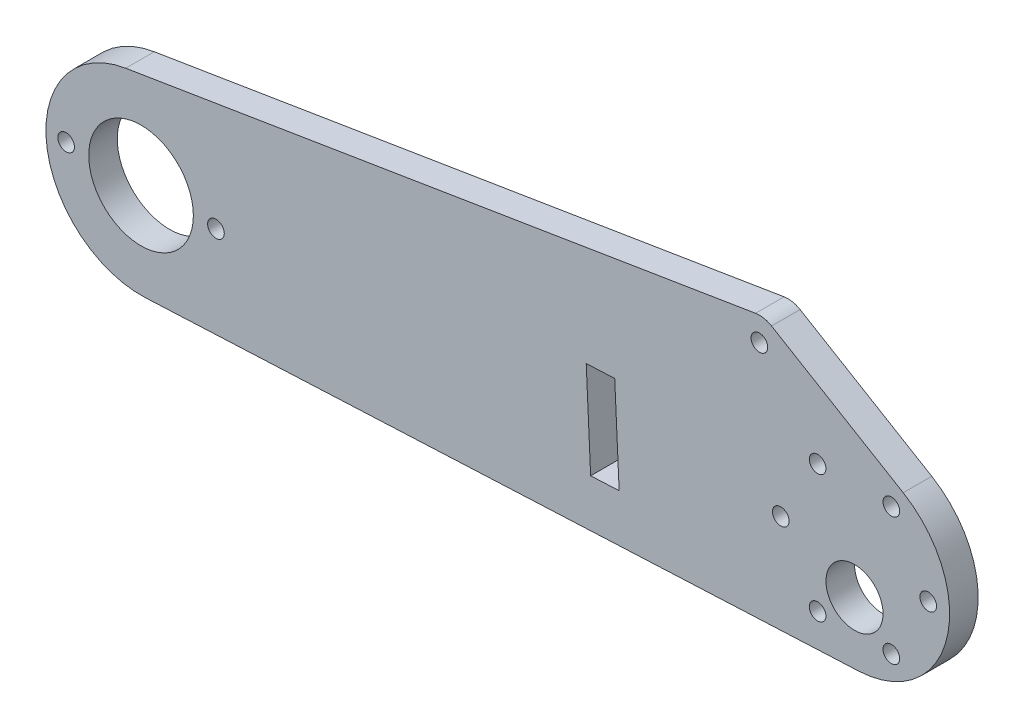
ISO-10303-21;
HEADER;
FILE_DESCRIPTION(('STEP AP214'),'2;1');
FILE_NAME('part.step','',(''),(''),'','','');
FILE_SCHEMA(('AUTOMOTIVE_DESIGN { 1 0 10303 214 1 1 1 1 }'));
ENDSEC;
DATA;
#1=APPLICATION_CONTEXT('core data for automotive mechanical design processes');
#2=APPLICATION_PROTOCOL_DEFINITION('international standard','automotive_design',2000,#1);
#3=PRODUCT_CONTEXT('',#1,'mechanical');
#4=PRODUCT('Part','Part','',(#3));
#5=PRODUCT_RELATED_PRODUCT_CATEGORY('part','',(#4));
#6=PRODUCT_DEFINITION_FORMATION('','',#4);
#7=PRODUCT_DEFINITION_CONTEXT('part definition',#1,'design');
#8=PRODUCT_DEFINITION('design','',#6,#7);
#9=PRODUCT_DEFINITION_SHAPE('','',#8);
#10=(LENGTH_UNIT() NAMED_UNIT(*) SI_UNIT(.MILLI.,.METRE.));
#11=(NAMED_UNIT(*) PLANE_ANGLE_UNIT() SI_UNIT($,.RADIAN.));
#12=(NAMED_UNIT(*) SI_UNIT($,.STERADIAN.) SOLID_ANGLE_UNIT());
#13=UNCERTAINTY_MEASURE_WITH_UNIT(LENGTH_MEASURE(1.E-05),#10,'distance_accuracy_value','');
#14=(GEOMETRIC_REPRESENTATION_CONTEXT(3) GLOBAL_UNCERTAINTY_ASSIGNED_CONTEXT((#13)) GLOBAL_UNIT_ASSIGNED_CONTEXT((#10,
#11,#12)) REPRESENTATION_CONTEXT('',''));
#15=CARTESIAN_POINT('',(0.,0.,0.));
#16=DIRECTION('',(0.,0.,1.));
#17=DIRECTION('',(1.,0.,0.));
#18=AXIS2_PLACEMENT_3D('',#15,#16,#17);
#19=CARTESIAN_POINT('',(0.,0.,4.));
#20=DIRECTION('',(0.,0.,1.));
#21=DIRECTION('',(1.,0.,0.));
#22=AXIS2_PLACEMENT_3D('',#19,#20,#21);
#23=PLANE('',#22);
#24=CARTESIAN_POINT('',(130.00156973698,36.3949428619018,4.));
#25=DIRECTION('',(0.,0.,-1.));
#26=DIRECTION('',(-1.,0.,0.));
#27=AXIS2_PLACEMENT_3D('',#24,#25,#26);
#28=CIRCLE('',#27,1.75);
#29=CARTESIAN_POINT('',(131.75156973698,36.3949428619018,4.));
#30=VERTEX_POINT('',#29);
#31=EDGE_CURVE('E287',#30,#30,#28,.T.);
#32=ORIENTED_EDGE('',*,*,#31,.T.);
#33=EDGE_LOOP('',(#32));
#34=FACE_BOUND('',#33,.T.);
#35=CARTESIAN_POINT('',(150.,0.,4.));
#36=DIRECTION('',(0.,0.,-1.));
#37=DIRECTION('',(-1.,0.,0.));
#38=AXIS2_PLACEMENT_3D('',#35,#36,#37);
#39=CIRCLE('',#38,6.);
#40=CARTESIAN_POINT('',(156.,0.,4.));
#41=VERTEX_POINT('',#40);
#42=EDGE_CURVE('E273',#41,#41,#39,.T.);
#43=ORIENTED_EDGE('',*,*,#42,.T.);
#44=EDGE_LOOP('',(#43));
#45=FACE_BOUND('',#44,.T.);
#46=CARTESIAN_POINT('',(157.75,-6.4233937586588,4.));
#47=DIRECTION('',(0.,0.,-1.));
#48=DIRECTION('',(-1.,0.,0.));
#49=AXIS2_PLACEMENT_3D('',#46,#47,#48);
#50=CIRCLE('',#49,1.75);
#51=CARTESIAN_POINT('',(159.5,-6.4233937586588,4.));
#52=VERTEX_POINT('',#51);
#53=EDGE_CURVE('E241',#52,#52,#50,.T.);
#54=ORIENTED_EDGE('',*,*,#53,.T.);
#55=EDGE_LOOP('',(#54));
#56=FACE_BOUND('',#55,.T.);
#57=CARTESIAN_POINT('',(134.5,7.,4.));
#58=DIRECTION('',(0.,0.,-1.));
#59=DIRECTION('',(-1.,0.,0.));
#60=AXIS2_PLACEMENT_3D('',#57,#58,#59);
#61=CIRCLE('',#60,1.75);
#62=CARTESIAN_POINT('',(136.25,7.,4.));
#63=VERTEX_POINT('',#62);
#64=EDGE_CURVE('E329',#63,#63,#61,.T.);
#65=ORIENTED_EDGE('',*,*,#64,.T.);
#66=EDGE_LOOP('',(#65));
#67=FACE_BOUND('',#66,.T.);
#68=CARTESIAN_POINT('',(142.25,-6.4233937586588,4.));
#69=DIRECTION('',(0.,0.,-1.));
#70=DIRECTION('',(-1.,0.,0.));
#71=AXIS2_PLACEMENT_3D('',#68,#69,#70);
#72=CIRCLE('',#71,1.75);
#73=CARTESIAN_POINT('',(144.,-6.4233937586588,4.));
#74=VERTEX_POINT('',#73);
#75=EDGE_CURVE('E288',#74,#74,#72,.T.);
#76=ORIENTED_EDGE('',*,*,#75,.T.);
#77=EDGE_LOOP('',(#76));
#78=FACE_BOUND('',#77,.T.);
#79=CARTESIAN_POINT('',(142.25,20.4233937586588,4.));
#80=DIRECTION('',(0.,0.,-1.));
#81=DIRECTION('',(-1.,0.,0.));
#82=AXIS2_PLACEMENT_3D('',#79,#80,#81);
#83=CIRCLE('',#82,1.75);
#84=CARTESIAN_POINT('',(144.,20.4233937586588,4.));
#85=VERTEX_POINT('',#84);
#86=EDGE_CURVE('E224',#85,#85,#83,.T.);
#87=ORIENTED_EDGE('',*,*,#86,.T.);
#88=EDGE_LOOP('',(#87));
#89=FACE_BOUND('',#88,.T.);
#90=CARTESIAN_POINT('',(157.75,20.4233937586588,4.));
#91=DIRECTION('',(0.,0.,-1.));
#92=DIRECTION('',(-1.,0.,0.));
#93=AXIS2_PLACEMENT_3D('',#90,#91,#92);
#94=CIRCLE('',#93,1.75);
#95=CARTESIAN_POINT('',(159.5,20.4233937586588,4.));
#96=VERTEX_POINT('',#95);
#97=EDGE_CURVE('E320',#96,#96,#94,.T.);
#98=ORIENTED_EDGE('',*,*,#97,.T.);
#99=EDGE_LOOP('',(#98));
#100=FACE_BOUND('',#99,.T.);
#101=CARTESIAN_POINT('',(165.5,7.,4.));
#102=DIRECTION('',(0.,0.,-1.));
#103=DIRECTION('',(-1.,0.,0.));
#104=AXIS2_PLACEMENT_3D('',#101,#102,#103);
#105=CIRCLE('',#104,1.75);
#106=CARTESIAN_POINT('',(167.25,7.,4.));
#107=VERTEX_POINT('',#106);
#108=EDGE_CURVE('E299',#107,#107,#105,.T.);
#109=ORIENTED_EDGE('',*,*,#108,.T.);
#110=EDGE_LOOP('',(#109));
#111=FACE_BOUND('',#110,.T.);
#112=CARTESIAN_POINT('',(0.,0.,4.));
#113=DIRECTION('',(0.,0.,-1.));
#114=DIRECTION('',(-1.,0.,0.));
#115=AXIS2_PLACEMENT_3D('',#112,#113,#114);
#116=CIRCLE('',#115,11.);
#117=CARTESIAN_POINT('',(11.,0.,4.));
#118=VERTEX_POINT('',#117);
#119=EDGE_CURVE('E293',#118,#118,#116,.T.);
#120=ORIENTED_EDGE('',*,*,#119,.T.);
#121=EDGE_LOOP('',(#120));
#122=FACE_BOUND('',#121,.T.);
#123=DIRECTION('',(0.998912886408086,0.046615934699044,0.));
#124=VECTOR('',#123,1.);
#125=CARTESIAN_POINT('',(49.5610184928074,12.3237304966048,4.));
#126=LINE('',#125,#124);
#127=CARTESIAN_POINT('',(93.5947190141567,14.3786365209344,4.));
#128=VERTEX_POINT('',#127);
#129=CARTESIAN_POINT('',(99.5881963326052,14.6583321291287,4.));
#130=VERTEX_POINT('',#129);
#131=EDGE_CURVE('E310',#128,#130,#126,.T.);
#132=ORIENTED_EDGE('',*,*,#131,.T.);
#133=DIRECTION('',(0.0466159346990444,-0.998912886408086,0.));
#134=VECTOR('',#133,1.);
#135=CARTESIAN_POINT('',(100.287435353091,-0.325361166992615,4.));
#136=LINE('',#135,#134);
#137=CARTESIAN_POINT('',(100.520515026586,-5.31992559903307,4.));
#138=VERTEX_POINT('',#137);
#139=EDGE_CURVE('E214',#130,#138,#136,.T.);
#140=ORIENTED_EDGE('',*,*,#139,.T.);
#141=DIRECTION('',(-0.998912886408086,-0.0466159346990447,0.));
#142=VECTOR('',#141,1.);
#143=CARTESIAN_POINT('',(47.496598527564,-7.79437503565414,4.));
#144=LINE('',#143,#142);
#145=CARTESIAN_POINT('',(94.5270377081376,-5.59962120722733,4.));
#146=VERTEX_POINT('',#145);
#147=EDGE_CURVE('E267',#138,#146,#144,.T.);
#148=ORIENTED_EDGE('',*,*,#147,.T.);
#149=DIRECTION('',(-0.0466159346990444,0.998912886408086,0.));
#150=VECTOR('',#149,1.);
#151=CARTESIAN_POINT('',(93.8277986876519,9.38407208889399,4.));
#152=LINE('',#151,#150);
#153=EDGE_CURVE('E235',#146,#128,#152,.T.);
#154=ORIENTED_EDGE('',*,*,#153,.T.);
#155=EDGE_LOOP('',(#132,#140,#148,#154));
#156=FACE_BOUND('',#155,.T.);
#157=CARTESIAN_POINT('',(15.75,0.,4.));
#158=DIRECTION('',(0.,0.,-1.));
#159=DIRECTION('',(-1.,0.,0.));
#160=AXIS2_PLACEMENT_3D('',#157,#158,#159);
#161=CIRCLE('',#160,1.75);
#162=CARTESIAN_POINT('',(17.5,0.,4.));
#163=VERTEX_POINT('',#162);
#164=EDGE_CURVE('E264',#163,#163,#161,.T.);
#165=ORIENTED_EDGE('',*,*,#164,.T.);
#166=EDGE_LOOP('',(#165));
#167=FACE_BOUND('',#166,.T.);
#168=CARTESIAN_POINT('',(-15.75,0.,4.));
#169=DIRECTION('',(0.,0.,-1.));
#170=DIRECTION('',(-1.,0.,0.));
#171=AXIS2_PLACEMENT_3D('',#168,#169,#170);
#172=CIRCLE('',#171,1.75);
#173=CARTESIAN_POINT('',(-14.,0.,4.));
#174=VERTEX_POINT('',#173);
#175=EDGE_CURVE('E253',#174,#174,#172,.T.);
#176=ORIENTED_EDGE('',*,*,#175,.T.);
#177=EDGE_LOOP('',(#176));
#178=FACE_BOUND('',#177,.T.);
#179=CARTESIAN_POINT('',(0.,0.,4.));
#180=DIRECTION('',(0.,0.,1.));
#181=DIRECTION('',(1.,0.,0.));
#182=AXIS2_PLACEMENT_3D('',#179,#180,#181);
#183=CIRCLE('',#182,20.);
#184=CARTESIAN_POINT('',(-3.21851350401239,19.7393305566448,4.));
#185=VERTEX_POINT('',#184);
#186=CARTESIAN_POINT('',(0.93231869398088,-19.9782577281617,4.));
#187=VERTEX_POINT('',#186);
#188=EDGE_CURVE('E10',#185,#187,#183,.T.);
#189=ORIENTED_EDGE('',*,*,#188,.T.);
#190=DIRECTION('',(0.998912886408086,0.046615934699044,0.));
#191=VECTOR('',#190,1.);
#192=CARTESIAN_POINT('',(0.932318693980881,-19.9782577281617,4.));
#193=LINE('',#192,#191);
#194=CARTESIAN_POINT('',(150.932318693981,-12.9782577281617,4.));
#195=VERTEX_POINT('',#194);
#196=EDGE_CURVE('E183',#187,#195,#193,.T.);
#197=ORIENTED_EDGE('',*,*,#196,.T.);
#198=CARTESIAN_POINT('',(150.,7.,4.));
#199=DIRECTION('',(0.,0.,1.));
#200=DIRECTION('',(1.,0.,0.));
#201=AXIS2_PLACEMENT_3D('',#198,#199,#200);
#202=CIRCLE('',#201,20.);
#203=CARTESIAN_POINT('',(160.245666414947,24.1763302167146,4.));
#204=VERTEX_POINT('',#203);
#205=EDGE_CURVE('E281',#195,#204,#202,.T.);
#206=ORIENTED_EDGE('',*,*,#205,.T.);
#207=DIRECTION('',(-0.858816510835732,0.512283320747356,0.));
#208=VECTOR('',#207,1.);
#209=CARTESIAN_POINT('',(160.245666414947,24.1763302167146,4.));
#210=LINE('',#209,#208);
#211=CARTESIAN_POINT('',(132.562986340717,40.6890254160805,4.));
#212=VERTEX_POINT('',#211);
#213=EDGE_CURVE('E340',#204,#212,#210,.T.);
#214=ORIENTED_EDGE('',*,*,#213,.T.);
#215=CARTESIAN_POINT('',(130.00156973698,36.3949428619018,4.));
#216=DIRECTION('',(0.,0.,1.));
#217=DIRECTION('',(1.,0.,0.));
#218=AXIS2_PLACEMENT_3D('',#215,#216,#217);
#219=CIRCLE('',#218,5.);
#220=CARTESIAN_POINT('',(129.196941360977,41.329775501063,4.));
#221=VERTEX_POINT('',#220);
#222=EDGE_CURVE('E386',#212,#221,#219,.T.);
#223=ORIENTED_EDGE('',*,*,#222,.T.);
#224=DIRECTION('',(-0.986966527832238,-0.16092567520062,0.));
#225=VECTOR('',#224,1.);
#226=CARTESIAN_POINT('',(129.196941360977,41.329775501063,4.));
#227=LINE('',#226,#225);
#228=EDGE_CURVE('E365',#221,#185,#227,.T.);
#229=ORIENTED_EDGE('',*,*,#228,.T.);
#230=EDGE_LOOP('',(#189,#197,#206,#214,#223,#229));
#231=FACE_BOUND('',#230,.T.);
#232=ADVANCED_FACE('F16',(#34,#45,#56,#67,#78,#89,#100,#111,#122,#156,#167,#178,#231),#23,.T.);
#233=CARTESIAN_POINT('',(0.,0.,0.));
#234=DIRECTION('',(0.,0.,1.));
#235=DIRECTION('',(-0.994583300266628,-0.103942574678241,0.));
#236=AXIS2_PLACEMENT_3D('',#233,#234,#235);
#237=CYLINDRICAL_SURFACE('',#236,20.);
#238=DIRECTION('',(0.,0.,1.));
#239=VECTOR('',#238,1.);
#240=CARTESIAN_POINT('',(0.932318693980881,-19.9782577281617,0.));
#241=LINE('',#240,#239);
#242=CARTESIAN_POINT('',(0.93231869398088,-19.9782577281617,-2.));
#243=VERTEX_POINT('',#242);
#244=EDGE_CURVE('E26',#243,#187,#241,.T.);
#245=ORIENTED_EDGE('',*,*,#244,.T.);
#246=ORIENTED_EDGE('',*,*,#188,.F.);
#247=DIRECTION('',(0.,0.,-1.));
#248=VECTOR('',#247,1.);
#249=CARTESIAN_POINT('',(-3.21851350401239,19.7393305566448,0.));
#250=LINE('',#249,#248);
#251=CARTESIAN_POINT('',(-3.21851350401239,19.7393305566448,-2.));
#252=VERTEX_POINT('',#251);
#253=EDGE_CURVE('E201',#185,#252,#250,.T.);
#254=ORIENTED_EDGE('',*,*,#253,.T.);
#255=CARTESIAN_POINT('',(0.,0.,-2.));
#256=DIRECTION('',(0.,0.,-1.));
#257=DIRECTION('',(1.,0.,0.));
#258=AXIS2_PLACEMENT_3D('',#255,#256,#257);
#259=CIRCLE('',#258,20.);
#260=EDGE_CURVE('E192',#243,#252,#259,.T.);
#261=ORIENTED_EDGE('',*,*,#260,.F.);
#262=EDGE_LOOP('',(#245,#246,#254,#261));
#263=FACE_BOUND('',#262,.T.);
#264=ADVANCED_FACE('F199',(#263),#237,.T.);
#265=CARTESIAN_POINT('',(0.932318693980881,-19.9782577281617,0.));
#266=DIRECTION('',(0.046615934699044,-0.998912886408087,0.));
#267=DIRECTION('',(0.,0.,-1.));
#268=AXIS2_PLACEMENT_3D('',#265,#266,#267);
#269=PLANE('',#268);
#270=DIRECTION('',(0.,0.,1.));
#271=VECTOR('',#270,1.);
#272=CARTESIAN_POINT('',(150.932318693981,-12.9782577281617,0.));
#273=LINE('',#272,#271);
#274=CARTESIAN_POINT('',(150.932318693981,-12.9782577281617,-2.));
#275=VERTEX_POINT('',#274);
#276=EDGE_CURVE('E278',#275,#195,#273,.T.);
#277=ORIENTED_EDGE('',*,*,#276,.T.);
#278=ORIENTED_EDGE('',*,*,#196,.F.);
#279=ORIENTED_EDGE('',*,*,#244,.F.);
#280=DIRECTION('',(-0.998912886408086,-0.046615934699044,0.));
#281=VECTOR('',#280,1.);
#282=CARTESIAN_POINT('',(0.932318693980881,-19.9782577281617,-2.));
#283=LINE('',#282,#281);
#284=EDGE_CURVE('E181',#275,#243,#283,.T.);
#285=ORIENTED_EDGE('',*,*,#284,.F.);
#286=EDGE_LOOP('',(#277,#278,#279,#285));
#287=FACE_BOUND('',#286,.T.);
#288=ADVANCED_FACE('F180',(#287),#269,.T.);
#289=CARTESIAN_POINT('',(150.,7.,0.));
#290=DIRECTION('',(0.,0.,1.));
#291=DIRECTION('',(1.,0.,0.));
#292=AXIS2_PLACEMENT_3D('',#289,#290,#291);
#293=CYLINDRICAL_SURFACE('',#292,20.);
#294=DIRECTION('',(0.,0.,1.));
#295=VECTOR('',#294,1.);
#296=CARTESIAN_POINT('',(160.245666414947,24.1763302167146,0.));
#297=LINE('',#296,#295);
#298=CARTESIAN_POINT('',(160.245666414947,24.1763302167146,-2.));
#299=VERTEX_POINT('',#298);
#300=EDGE_CURVE('E336',#299,#204,#297,.T.);
#301=ORIENTED_EDGE('',*,*,#300,.T.);
#302=ORIENTED_EDGE('',*,*,#205,.F.);
#303=ORIENTED_EDGE('',*,*,#276,.F.);
#304=CARTESIAN_POINT('',(150.,7.,-2.));
#305=DIRECTION('',(0.,0.,-1.));
#306=DIRECTION('',(1.,0.,0.));
#307=AXIS2_PLACEMENT_3D('',#304,#305,#306);
#308=CIRCLE('',#307,20.);
#309=EDGE_CURVE('E195',#299,#275,#308,.T.);
#310=ORIENTED_EDGE('',*,*,#309,.F.);
#311=EDGE_LOOP('',(#301,#302,#303,#310));
#312=FACE_BOUND('',#311,.T.);
#313=ADVANCED_FACE('F511',(#312),#293,.T.);
#314=CARTESIAN_POINT('',(160.245666414947,24.1763302167146,0.));
#315=DIRECTION('',(0.512283320747356,0.858816510835732,0.));
#316=DIRECTION('',(0.,0.,-1.));
#317=AXIS2_PLACEMENT_3D('',#314,#315,#316);
#318=PLANE('',#317);
#319=DIRECTION('',(0.,0.,1.));
#320=VECTOR('',#319,1.);
#321=CARTESIAN_POINT('',(132.562986340717,40.6890254160805,0.));
#322=LINE('',#321,#320);
#323=CARTESIAN_POINT('',(132.562986340717,40.6890254160805,-2.));
#324=VERTEX_POINT('',#323);
#325=EDGE_CURVE('E383',#324,#212,#322,.T.);
#326=ORIENTED_EDGE('',*,*,#325,.T.);
#327=ORIENTED_EDGE('',*,*,#213,.F.);
#328=ORIENTED_EDGE('',*,*,#300,.F.);
#329=DIRECTION('',(0.858816510835732,-0.512283320747356,0.));
#330=VECTOR('',#329,1.);
#331=CARTESIAN_POINT('',(160.245666414947,24.1763302167146,-2.));
#332=LINE('',#331,#330);
#333=EDGE_CURVE('E222',#324,#299,#332,.T.);
#334=ORIENTED_EDGE('',*,*,#333,.F.);
#335=EDGE_LOOP('',(#326,#327,#328,#334));
#336=FACE_BOUND('',#335,.T.);
#337=ADVANCED_FACE('F512',(#336),#318,.T.);
#338=CARTESIAN_POINT('',(130.00156973698,36.3949428619018,0.));
#339=DIRECTION('',(0.,0.,1.));
#340=DIRECTION('',(1.,0.,0.));
#341=AXIS2_PLACEMENT_3D('',#338,#339,#340);
#342=CYLINDRICAL_SURFACE('',#341,5.);
#343=DIRECTION('',(0.,0.,1.));
#344=VECTOR('',#343,1.);
#345=CARTESIAN_POINT('',(129.196941360977,41.329775501063,0.));
#346=LINE('',#345,#344);
#347=CARTESIAN_POINT('',(129.196941360977,41.329775501063,-2.));
#348=VERTEX_POINT('',#347);
#349=EDGE_CURVE('E368',#348,#221,#346,.T.);
#350=ORIENTED_EDGE('',*,*,#349,.T.);
#351=ORIENTED_EDGE('',*,*,#222,.F.);
#352=ORIENTED_EDGE('',*,*,#325,.F.);
#353=CARTESIAN_POINT('',(130.00156973698,36.3949428619018,-2.));
#354=DIRECTION('',(0.,0.,-1.));
#355=DIRECTION('',(1.,0.,0.));
#356=AXIS2_PLACEMENT_3D('',#353,#354,#355);
#357=CIRCLE('',#356,5.);
#358=EDGE_CURVE('E212',#348,#324,#357,.T.);
#359=ORIENTED_EDGE('',*,*,#358,.F.);
#360=EDGE_LOOP('',(#350,#351,#352,#359));
#361=FACE_BOUND('',#360,.T.);
#362=ADVANCED_FACE('F514',(#361),#342,.T.);
#363=CARTESIAN_POINT('',(129.196941360977,41.329775501063,0.));
#364=DIRECTION('',(-0.16092567520062,0.986966527832238,0.));
#365=DIRECTION('',(0.,0.,1.));
#366=AXIS2_PLACEMENT_3D('',#363,#364,#365);
#367=PLANE('',#366);
#368=ORIENTED_EDGE('',*,*,#253,.F.);
#369=ORIENTED_EDGE('',*,*,#228,.F.);
#370=ORIENTED_EDGE('',*,*,#349,.F.);
#371=DIRECTION('',(0.986966527832238,0.16092567520062,0.));
#372=VECTOR('',#371,1.);
#373=CARTESIAN_POINT('',(129.196941360977,41.329775501063,-2.));
#374=LINE('',#373,#372);
#375=EDGE_CURVE('E204',#252,#348,#374,.T.);
#376=ORIENTED_EDGE('',*,*,#375,.F.);
#377=EDGE_LOOP('',(#368,#369,#370,#376));
#378=FACE_BOUND('',#377,.T.);
#379=ADVANCED_FACE('F520',(#378),#367,.T.);
#380=CARTESIAN_POINT('',(0.,0.,0.));
#381=DIRECTION('',(0.,0.,1.));
#382=DIRECTION('',(-1.,0.,0.));
#383=AXIS2_PLACEMENT_3D('',#380,#381,#382);
#384=CYLINDRICAL_SURFACE('',#383,11.);
#385=ORIENTED_EDGE('',*,*,#119,.F.);
#386=DIRECTION('',(0.,0.,-1.));
#387=VECTOR('',#386,1.);
#388=CARTESIAN_POINT('',(11.,0.,0.));
#389=LINE('',#388,#387);
#390=CARTESIAN_POINT('',(11.,0.,-2.));
#391=VERTEX_POINT('',#390);
#392=EDGE_CURVE('E297',#118,#391,#389,.T.);
#393=ORIENTED_EDGE('',*,*,#392,.T.);
#394=CARTESIAN_POINT('',(0.,0.,-2.));
#395=DIRECTION('',(0.,0.,1.));
#396=DIRECTION('',(-1.,0.,0.));
#397=AXIS2_PLACEMENT_3D('',#394,#395,#396);
#398=CIRCLE('',#397,11.);
#399=EDGE_CURVE('E197',#391,#391,#398,.T.);
#400=ORIENTED_EDGE('',*,*,#399,.F.);
#401=ORIENTED_EDGE('',*,*,#392,.F.);
#402=EDGE_LOOP('',(#385,#393,#400,#401));
#403=FACE_BOUND('',#402,.T.);
#404=ADVANCED_FACE('F472',(#403),#384,.F.);
#405=CARTESIAN_POINT('',(165.5,7.,0.));
#406=DIRECTION('',(0.,0.,1.));
#407=DIRECTION('',(-1.,0.,0.));
#408=AXIS2_PLACEMENT_3D('',#405,#406,#407);
#409=CYLINDRICAL_SURFACE('',#408,1.75);
#410=ORIENTED_EDGE('',*,*,#108,.F.);
#411=DIRECTION('',(0.,0.,-1.));
#412=VECTOR('',#411,1.);
#413=CARTESIAN_POINT('',(167.25,7.,0.));
#414=LINE('',#413,#412);
#415=CARTESIAN_POINT('',(167.25,7.,-2.));
#416=VERTEX_POINT('',#415);
#417=EDGE_CURVE('E298',#107,#416,#414,.T.);
#418=ORIENTED_EDGE('',*,*,#417,.T.);
#419=CARTESIAN_POINT('',(165.5,7.,-2.));
#420=DIRECTION('',(0.,0.,1.));
#421=DIRECTION('',(-1.,0.,0.));
#422=AXIS2_PLACEMENT_3D('',#419,#420,#421);
#423=CIRCLE('',#422,1.75);
#424=EDGE_CURVE('E19',#416,#416,#423,.T.);
#425=ORIENTED_EDGE('',*,*,#424,.F.);
#426=ORIENTED_EDGE('',*,*,#417,.F.);
#427=EDGE_LOOP('',(#410,#418,#425,#426));
#428=FACE_BOUND('',#427,.T.);
#429=ADVANCED_FACE('F551',(#428),#409,.F.);
#430=CARTESIAN_POINT('',(157.75,20.4233937586588,0.));
#431=DIRECTION('',(0.,0.,1.));
#432=DIRECTION('',(-1.,0.,0.));
#433=AXIS2_PLACEMENT_3D('',#430,#431,#432);
#434=CYLINDRICAL_SURFACE('',#433,1.75);
#435=ORIENTED_EDGE('',*,*,#97,.F.);
#436=DIRECTION('',(0.,0.,-1.));
#437=VECTOR('',#436,1.);
#438=CARTESIAN_POINT('',(159.5,20.4233937586588,0.));
#439=LINE('',#438,#437);
#440=CARTESIAN_POINT('',(159.5,20.4233937586588,-2.));
#441=VERTEX_POINT('',#440);
#442=EDGE_CURVE('E303',#96,#441,#439,.T.);
#443=ORIENTED_EDGE('',*,*,#442,.T.);
#444=CARTESIAN_POINT('',(157.75,20.4233937586588,-2.));
#445=DIRECTION('',(0.,0.,1.));
#446=DIRECTION('',(-1.,0.,0.));
#447=AXIS2_PLACEMENT_3D('',#444,#445,#446);
#448=CIRCLE('',#447,1.75);
#449=EDGE_CURVE('E252',#441,#441,#448,.T.);
#450=ORIENTED_EDGE('',*,*,#449,.F.);
#451=ORIENTED_EDGE('',*,*,#442,.F.);
#452=EDGE_LOOP('',(#435,#443,#450,#451));
#453=FACE_BOUND('',#452,.T.);
#454=ADVANCED_FACE('F547',(#453),#434,.F.);
#455=CARTESIAN_POINT('',(142.25,20.4233937586588,0.));
#456=DIRECTION('',(0.,0.,1.));
#457=DIRECTION('',(-1.,0.,0.));
#458=AXIS2_PLACEMENT_3D('',#455,#456,#457);
#459=CYLINDRICAL_SURFACE('',#458,1.75);
#460=ORIENTED_EDGE('',*,*,#86,.F.);
#461=DIRECTION('',(0.,0.,-1.));
#462=VECTOR('',#461,1.);
#463=CARTESIAN_POINT('',(144.,20.4233937586588,0.));
#464=LINE('',#463,#462);
#465=CARTESIAN_POINT('',(144.,20.4233937586588,-2.));
#466=VERTEX_POINT('',#465);
#467=EDGE_CURVE('E228',#85,#466,#464,.T.);
#468=ORIENTED_EDGE('',*,*,#467,.T.);
#469=CARTESIAN_POINT('',(142.25,20.4233937586588,-2.));
#470=DIRECTION('',(0.,0.,1.));
#471=DIRECTION('',(-1.,0.,0.));
#472=AXIS2_PLACEMENT_3D('',#469,#470,#471);
#473=CIRCLE('',#472,1.75);
#474=EDGE_CURVE('E247',#466,#466,#473,.T.);
#475=ORIENTED_EDGE('',*,*,#474,.F.);
#476=ORIENTED_EDGE('',*,*,#467,.F.);
#477=EDGE_LOOP('',(#460,#468,#475,#476));
#478=FACE_BOUND('',#477,.T.);
#479=ADVANCED_FACE('F543',(#478),#459,.F.);
#480=CARTESIAN_POINT('',(142.25,-6.4233937586588,0.));
#481=DIRECTION('',(0.,0.,1.));
#482=DIRECTION('',(-1.,0.,0.));
#483=AXIS2_PLACEMENT_3D('',#480,#481,#482);
#484=CYLINDRICAL_SURFACE('',#483,1.75);
#485=ORIENTED_EDGE('',*,*,#75,.F.);
#486=DIRECTION('',(0.,0.,-1.));
#487=VECTOR('',#486,1.);
#488=CARTESIAN_POINT('',(144.,-6.4233937586588,0.));
#489=LINE('',#488,#487);
#490=CARTESIAN_POINT('',(144.,-6.4233937586588,-2.));
#491=VERTEX_POINT('',#490);
#492=EDGE_CURVE('E229',#74,#491,#489,.T.);
#493=ORIENTED_EDGE('',*,*,#492,.T.);
#494=CARTESIAN_POINT('',(142.25,-6.4233937586588,-2.));
#495=DIRECTION('',(0.,0.,1.));
#496=DIRECTION('',(-1.,0.,0.));
#497=AXIS2_PLACEMENT_3D('',#494,#495,#496);
#498=CIRCLE('',#497,1.75);
#499=EDGE_CURVE('E251',#491,#491,#498,.T.);
#500=ORIENTED_EDGE('',*,*,#499,.F.);
#501=ORIENTED_EDGE('',*,*,#492,.F.);
#502=EDGE_LOOP('',(#485,#493,#500,#501));
#503=FACE_BOUND('',#502,.T.);
#504=ADVANCED_FACE('F539',(#503),#484,.F.);
#505=CARTESIAN_POINT('',(134.5,7.,0.));
#506=DIRECTION('',(0.,0.,1.));
#507=DIRECTION('',(-1.,0.,0.));
#508=AXIS2_PLACEMENT_3D('',#505,#506,#507);
#509=CYLINDRICAL_SURFACE('',#508,1.75);
#510=ORIENTED_EDGE('',*,*,#64,.F.);
#511=DIRECTION('',(0.,0.,-1.));
#512=VECTOR('',#511,1.);
#513=CARTESIAN_POINT('',(136.25,7.,0.));
#514=LINE('',#513,#512);
#515=CARTESIAN_POINT('',(136.25,7.,-2.));
#516=VERTEX_POINT('',#515);
#517=EDGE_CURVE('E292',#63,#516,#514,.T.);
#518=ORIENTED_EDGE('',*,*,#517,.T.);
#519=CARTESIAN_POINT('',(134.5,7.,-2.));
#520=DIRECTION('',(0.,0.,1.));
#521=DIRECTION('',(-1.,0.,0.));
#522=AXIS2_PLACEMENT_3D('',#519,#520,#521);
#523=CIRCLE('',#522,1.75);
#524=EDGE_CURVE('E259',#516,#516,#523,.T.);
#525=ORIENTED_EDGE('',*,*,#524,.F.);
#526=ORIENTED_EDGE('',*,*,#517,.F.);
#527=EDGE_LOOP('',(#510,#518,#525,#526));
#528=FACE_BOUND('',#527,.T.);
#529=ADVANCED_FACE('F542',(#528),#509,.F.);
#530=CARTESIAN_POINT('',(157.75,-6.4233937586588,0.));
#531=DIRECTION('',(0.,0.,1.));
#532=DIRECTION('',(-1.,0.,0.));
#533=AXIS2_PLACEMENT_3D('',#530,#531,#532);
#534=CYLINDRICAL_SURFACE('',#533,1.75);
#535=ORIENTED_EDGE('',*,*,#53,.F.);
#536=DIRECTION('',(0.,0.,-1.));
#537=VECTOR('',#536,1.);
#538=CARTESIAN_POINT('',(159.5,-6.4233937586588,0.));
#539=LINE('',#538,#537);
#540=CARTESIAN_POINT('',(159.5,-6.4233937586588,-2.));
#541=VERTEX_POINT('',#540);
#542=EDGE_CURVE('E245',#52,#541,#539,.T.);
#543=ORIENTED_EDGE('',*,*,#542,.T.);
#544=CARTESIAN_POINT('',(157.75,-6.4233937586588,-2.));
#545=DIRECTION('',(0.,0.,1.));
#546=DIRECTION('',(-1.,0.,0.));
#547=AXIS2_PLACEMENT_3D('',#544,#545,#546);
#548=CIRCLE('',#547,1.75);
#549=EDGE_CURVE('E263',#541,#541,#548,.T.);
#550=ORIENTED_EDGE('',*,*,#549,.F.);
#551=ORIENTED_EDGE('',*,*,#542,.F.);
#552=EDGE_LOOP('',(#535,#543,#550,#551));
#553=FACE_BOUND('',#552,.T.);
#554=ADVANCED_FACE('F554',(#553),#534,.F.);
#555=CARTESIAN_POINT('',(150.,0.,0.));
#556=DIRECTION('',(0.,0.,1.));
#557=DIRECTION('',(-1.,0.,0.));
#558=AXIS2_PLACEMENT_3D('',#555,#556,#557);
#559=CYLINDRICAL_SURFACE('',#558,6.);
#560=ORIENTED_EDGE('',*,*,#42,.F.);
#561=DIRECTION('',(0.,0.,-1.));
#562=VECTOR('',#561,1.);
#563=CARTESIAN_POINT('',(156.,0.,0.));
#564=LINE('',#563,#562);
#565=CARTESIAN_POINT('',(156.,0.,-2.));
#566=VERTEX_POINT('',#565);
#567=EDGE_CURVE('E246',#41,#566,#564,.T.);
#568=ORIENTED_EDGE('',*,*,#567,.T.);
#569=CARTESIAN_POINT('',(150.,0.,-2.));
#570=DIRECTION('',(0.,0.,1.));
#571=DIRECTION('',(-1.,0.,0.));
#572=AXIS2_PLACEMENT_3D('',#569,#570,#571);
#573=CIRCLE('',#572,6.);
#574=EDGE_CURVE('E272',#566,#566,#573,.T.);
#575=ORIENTED_EDGE('',*,*,#574,.F.);
#576=ORIENTED_EDGE('',*,*,#567,.F.);
#577=EDGE_LOOP('',(#560,#568,#575,#576));
#578=FACE_BOUND('',#577,.T.);
#579=ADVANCED_FACE('F529',(#578),#559,.F.);
#580=CARTESIAN_POINT('',(130.00156973698,36.3949428619018,0.));
#581=DIRECTION('',(0.,0.,1.));
#582=DIRECTION('',(-1.,0.,0.));
#583=AXIS2_PLACEMENT_3D('',#580,#581,#582);
#584=CYLINDRICAL_SURFACE('',#583,1.75);
#585=ORIENTED_EDGE('',*,*,#31,.F.);
#586=DIRECTION('',(0.,0.,-1.));
#587=VECTOR('',#586,1.);
#588=CARTESIAN_POINT('',(131.75156973698,36.3949428619018,0.));
#589=LINE('',#588,#587);
#590=CARTESIAN_POINT('',(131.75156973698,36.3949428619018,-2.));
#591=VERTEX_POINT('',#590);
#592=EDGE_CURVE('E277',#30,#591,#589,.T.);
#593=ORIENTED_EDGE('',*,*,#592,.T.);
#594=CARTESIAN_POINT('',(130.00156973698,36.3949428619018,-2.));
#595=DIRECTION('',(0.,0.,1.));
#596=DIRECTION('',(-1.,0.,0.));
#597=AXIS2_PLACEMENT_3D('',#594,#595,#596);
#598=CIRCLE('',#597,1.75);
#599=EDGE_CURVE('E309',#591,#591,#598,.T.);
#600=ORIENTED_EDGE('',*,*,#599,.F.);
#601=ORIENTED_EDGE('',*,*,#592,.F.);
#602=EDGE_LOOP('',(#585,#593,#600,#601));
#603=FACE_BOUND('',#602,.T.);
#604=ADVANCED_FACE('F477',(#603),#584,.F.);
#605=CARTESIAN_POINT('',(0.,0.,-2.));
#606=DIRECTION('',(0.,0.,1.));
#607=DIRECTION('',(1.,0.,0.));
#608=AXIS2_PLACEMENT_3D('',#605,#606,#607);
#609=PLANE('',#608);
#610=ORIENTED_EDGE('',*,*,#599,.T.);
#611=EDGE_LOOP('',(#610));
#612=FACE_BOUND('',#611,.T.);
#613=ORIENTED_EDGE('',*,*,#574,.T.);
#614=EDGE_LOOP('',(#613));
#615=FACE_BOUND('',#614,.T.);
#616=ORIENTED_EDGE('',*,*,#549,.T.);
#617=EDGE_LOOP('',(#616));
#618=FACE_BOUND('',#617,.T.);
#619=ORIENTED_EDGE('',*,*,#524,.T.);
#620=EDGE_LOOP('',(#619));
#621=FACE_BOUND('',#620,.T.);
#622=ORIENTED_EDGE('',*,*,#499,.T.);
#623=EDGE_LOOP('',(#622));
#624=FACE_BOUND('',#623,.T.);
#625=ORIENTED_EDGE('',*,*,#474,.T.);
#626=EDGE_LOOP('',(#625));
#627=FACE_BOUND('',#626,.T.);
#628=ORIENTED_EDGE('',*,*,#449,.T.);
#629=EDGE_LOOP('',(#628));
#630=FACE_BOUND('',#629,.T.);
#631=ORIENTED_EDGE('',*,*,#424,.T.);
#632=EDGE_LOOP('',(#631));
#633=FACE_BOUND('',#632,.T.);
#634=ORIENTED_EDGE('',*,*,#399,.T.);
#635=EDGE_LOOP('',(#634));
#636=FACE_BOUND('',#635,.T.);
#637=DIRECTION('',(-0.998912886408086,-0.046615934699044,0.));
#638=VECTOR('',#637,1.);
#639=CARTESIAN_POINT('',(49.5610184928074,12.3237304966048,-2.));
#640=LINE('',#639,#638);
#641=CARTESIAN_POINT('',(99.5881963326052,14.6583321291287,-2.));
#642=VERTEX_POINT('',#641);
#643=CARTESIAN_POINT('',(93.5947190141567,14.3786365209344,-2.));
#644=VERTEX_POINT('',#643);
#645=EDGE_CURVE('E313',#642,#644,#640,.T.);
#646=ORIENTED_EDGE('',*,*,#645,.T.);
#647=DIRECTION('',(0.0466159346990444,-0.998912886408086,0.));
#648=VECTOR('',#647,1.);
#649=CARTESIAN_POINT('',(93.8277986876519,9.38407208889399,-2.));
#650=LINE('',#649,#648);
#651=CARTESIAN_POINT('',(94.5270377081376,-5.59962120722733,-2.));
#652=VERTEX_POINT('',#651);
#653=EDGE_CURVE('E230',#644,#652,#650,.T.);
#654=ORIENTED_EDGE('',*,*,#653,.T.);
#655=DIRECTION('',(0.998912886408086,0.0466159346990447,0.));
#656=VECTOR('',#655,1.);
#657=CARTESIAN_POINT('',(47.496598527564,-7.79437503565414,-2.));
#658=LINE('',#657,#656);
#659=CARTESIAN_POINT('',(100.520515026586,-5.31992559903307,-2.));
#660=VERTEX_POINT('',#659);
#661=EDGE_CURVE('E348',#652,#660,#658,.T.);
#662=ORIENTED_EDGE('',*,*,#661,.T.);
#663=DIRECTION('',(-0.0466159346990444,0.998912886408086,0.));
#664=VECTOR('',#663,1.);
#665=CARTESIAN_POINT('',(100.287435353091,-0.325361166992615,-2.));
#666=LINE('',#665,#664);
#667=EDGE_CURVE('E205',#660,#642,#666,.T.);
#668=ORIENTED_EDGE('',*,*,#667,.T.);
#669=EDGE_LOOP('',(#646,#654,#662,#668));
#670=FACE_BOUND('',#669,.T.);
#671=CARTESIAN_POINT('',(15.75,0.,-2.));
#672=DIRECTION('',(0.,0.,1.));
#673=DIRECTION('',(-1.,0.,0.));
#674=AXIS2_PLACEMENT_3D('',#671,#672,#673);
#675=CIRCLE('',#674,1.75);
#676=CARTESIAN_POINT('',(17.5,0.,-2.));
#677=VERTEX_POINT('',#676);
#678=EDGE_CURVE('E257',#677,#677,#675,.T.);
#679=ORIENTED_EDGE('',*,*,#678,.T.);
#680=EDGE_LOOP('',(#679));
#681=FACE_BOUND('',#680,.T.);
#682=CARTESIAN_POINT('',(-15.75,0.,-2.));
#683=DIRECTION('',(0.,0.,1.));
#684=DIRECTION('',(-1.,0.,0.));
#685=AXIS2_PLACEMENT_3D('',#682,#683,#684);
#686=CIRCLE('',#685,1.75);
#687=CARTESIAN_POINT('',(-14.,0.,-2.));
#688=VERTEX_POINT('',#687);
#689=EDGE_CURVE('E218',#688,#688,#686,.T.);
#690=ORIENTED_EDGE('',*,*,#689,.T.);
#691=EDGE_LOOP('',(#690));
#692=FACE_BOUND('',#691,.T.);
#693=ORIENTED_EDGE('',*,*,#260,.T.);
#694=ORIENTED_EDGE('',*,*,#375,.T.);
#695=ORIENTED_EDGE('',*,*,#358,.T.);
#696=ORIENTED_EDGE('',*,*,#333,.T.);
#697=ORIENTED_EDGE('',*,*,#309,.T.);
#698=ORIENTED_EDGE('',*,*,#284,.T.);
#699=EDGE_LOOP('',(#693,#694,#695,#696,#697,#698));
#700=FACE_BOUND('',#699,.T.);
#701=ADVANCED_FACE('F190',(#612,#615,#618,#621,#624,#627,#630,#633,#636,#670,#681,#692,#700),
#609,.F.);
#702=CARTESIAN_POINT('',(100.520515026586,-5.31992559903307,-2.));
#703=DIRECTION('',(0.998912886408086,0.0466159346990445,0.));
#704=DIRECTION('',(0.,0.,-1.));
#705=AXIS2_PLACEMENT_3D('',#702,#703,#704);
#706=PLANE('',#705);
#707=ORIENTED_EDGE('',*,*,#139,.F.);
#708=DIRECTION('',(0.,0.,1.));
#709=VECTOR('',#708,1.);
#710=CARTESIAN_POINT('',(99.5881963326052,14.6583321291287,-2.));
#711=LINE('',#710,#709);
#712=EDGE_CURVE('E326',#642,#130,#711,.T.);
#713=ORIENTED_EDGE('',*,*,#712,.F.);
#714=ORIENTED_EDGE('',*,*,#667,.F.);
#715=DIRECTION('',(0.,0.,1.));
#716=VECTOR('',#715,1.);
#717=CARTESIAN_POINT('',(100.520515026586,-5.31992559903307,-2.));
#718=LINE('',#717,#716);
#719=EDGE_CURVE('E361',#660,#138,#718,.T.);
#720=ORIENTED_EDGE('',*,*,#719,.T.);
#721=EDGE_LOOP('',(#707,#713,#714,#720));
#722=FACE_BOUND('',#721,.T.);
#723=ADVANCED_FACE('F476',(#722),#706,.F.);
#724=CARTESIAN_POINT('',(99.5881963326052,14.6583321291287,-2.));
#725=DIRECTION('',(-0.046615934699044,0.998912886408087,0.));
#726=DIRECTION('',(0.,0.,1.));
#727=AXIS2_PLACEMENT_3D('',#724,#725,#726);
#728=PLANE('',#727);
#729=ORIENTED_EDGE('',*,*,#131,.F.);
#730=DIRECTION('',(0.,0.,1.));
#731=VECTOR('',#730,1.);
#732=CARTESIAN_POINT('',(93.5947190141567,14.3786365209344,-2.));
#733=LINE('',#732,#731);
#734=EDGE_CURVE('E234',#644,#128,#733,.T.);
#735=ORIENTED_EDGE('',*,*,#734,.F.);
#736=ORIENTED_EDGE('',*,*,#645,.F.);
#737=ORIENTED_EDGE('',*,*,#712,.T.);
#738=EDGE_LOOP('',(#729,#735,#736,#737));
#739=FACE_BOUND('',#738,.T.);
#740=ADVANCED_FACE('F487',(#739),#728,.F.);
#741=CARTESIAN_POINT('',(93.5947190141567,14.3786365209344,-2.));
#742=DIRECTION('',(-0.998912886408086,-0.0466159346990444,0.));
#743=DIRECTION('',(-0.0466159346990444,0.998912886408086,0.));
#744=AXIS2_PLACEMENT_3D('',#741,#742,#743);
#745=PLANE('',#744);
#746=ORIENTED_EDGE('',*,*,#153,.F.);
#747=DIRECTION('',(0.,0.,1.));
#748=VECTOR('',#747,1.);
#749=CARTESIAN_POINT('',(94.5270377081376,-5.59962120722733,-2.));
#750=LINE('',#749,#748);
#751=EDGE_CURVE('E344',#652,#146,#750,.T.);
#752=ORIENTED_EDGE('',*,*,#751,.F.);
#753=ORIENTED_EDGE('',*,*,#653,.F.);
#754=ORIENTED_EDGE('',*,*,#734,.T.);
#755=EDGE_LOOP('',(#746,#752,#753,#754));
#756=FACE_BOUND('',#755,.T.);
#757=ADVANCED_FACE('F489',(#756),#745,.F.);
#758=CARTESIAN_POINT('',(94.5270377081376,-5.59962120722733,-2.));
#759=DIRECTION('',(0.0466159346990447,-0.998912886408086,0.));
#760=DIRECTION('',(0.,0.,-1.));
#761=AXIS2_PLACEMENT_3D('',#758,#759,#760);
#762=PLANE('',#761);
#763=ORIENTED_EDGE('',*,*,#147,.F.);
#764=ORIENTED_EDGE('',*,*,#719,.F.);
#765=ORIENTED_EDGE('',*,*,#661,.F.);
#766=ORIENTED_EDGE('',*,*,#751,.T.);
#767=EDGE_LOOP('',(#763,#764,#765,#766));
#768=FACE_BOUND('',#767,.T.);
#769=ADVANCED_FACE('F496',(#768),#762,.F.);
#770=CARTESIAN_POINT('',(15.75,0.,-2.));
#771=DIRECTION('',(0.,0.,1.));
#772=DIRECTION('',(-1.,0.,0.));
#773=AXIS2_PLACEMENT_3D('',#770,#771,#772);
#774=CYLINDRICAL_SURFACE('',#773,1.75);
#775=ORIENTED_EDGE('',*,*,#678,.F.);
#776=DIRECTION('',(0.,0.,1.));
#777=VECTOR('',#776,1.);
#778=CARTESIAN_POINT('',(17.5,0.,-2.));
#779=LINE('',#778,#777);
#780=EDGE_CURVE('E268',#677,#163,#779,.T.);
#781=ORIENTED_EDGE('',*,*,#780,.T.);
#782=ORIENTED_EDGE('',*,*,#164,.F.);
#783=ORIENTED_EDGE('',*,*,#780,.F.);
#784=EDGE_LOOP('',(#775,#781,#782,#783));
#785=FACE_BOUND('',#784,.T.);
#786=ADVANCED_FACE('F456',(#785),#774,.F.);
#787=CARTESIAN_POINT('',(-15.75,0.,-2.));
#788=DIRECTION('',(0.,0.,1.));
#789=DIRECTION('',(-1.,0.,0.));
#790=AXIS2_PLACEMENT_3D('',#787,#788,#789);
#791=CYLINDRICAL_SURFACE('',#790,1.75);
#792=ORIENTED_EDGE('',*,*,#689,.F.);
#793=DIRECTION('',(0.,0.,1.));
#794=VECTOR('',#793,1.);
#795=CARTESIAN_POINT('',(-14.,0.,-2.));
#796=LINE('',#795,#794);
#797=EDGE_CURVE('E258',#688,#174,#796,.T.);
#798=ORIENTED_EDGE('',*,*,#797,.T.);
#799=ORIENTED_EDGE('',*,*,#175,.F.);
#800=ORIENTED_EDGE('',*,*,#797,.F.);
#801=EDGE_LOOP('',(#792,#798,#799,#800));
#802=FACE_BOUND('',#801,.T.);
#803=ADVANCED_FACE('F423',(#802),#791,.F.);
#804=CLOSED_SHELL('',(#232,#264,#288,#313,#337,#362,#379,#404,#429,#454,#479,#504,#529,#554,
#579,#604,#701,#723,#740,#757,#769,#786,#803));
#805=MANIFOLD_SOLID_BREP('B1',#804);
#806=ADVANCED_BREP_SHAPE_REPRESENTATION('',(#18,#805),#14);
#807=SHAPE_DEFINITION_REPRESENTATION(#9,#806);
ENDSEC;
END-ISO-10303-21;
